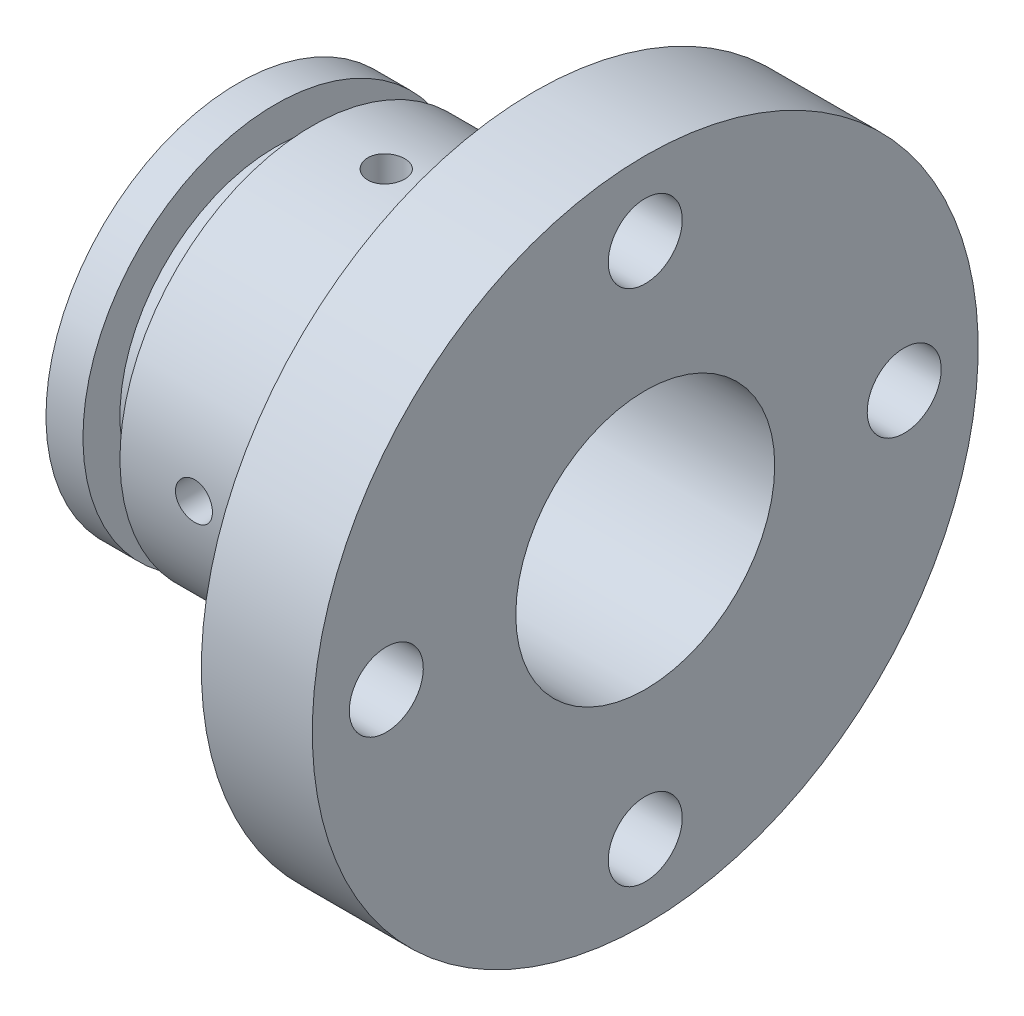
ISO-10303-21;
HEADER;
FILE_DESCRIPTION(('STEP AP214'),'2;1');
FILE_NAME('part.step','',(''),(''),'','','');
FILE_SCHEMA(('AUTOMOTIVE_DESIGN { 1 0 10303 214 1 1 1 1 }'));
ENDSEC;
DATA;
#1=APPLICATION_CONTEXT('core data for automotive mechanical design processes');
#2=APPLICATION_PROTOCOL_DEFINITION('international standard','automotive_design',2000,#1);
#3=PRODUCT_CONTEXT('',#1,'mechanical');
#4=PRODUCT('Part','Part','',(#3));
#5=PRODUCT_RELATED_PRODUCT_CATEGORY('part','',(#4));
#6=PRODUCT_DEFINITION_FORMATION('','',#4);
#7=PRODUCT_DEFINITION_CONTEXT('part definition',#1,'design');
#8=PRODUCT_DEFINITION('design','',#6,#7);
#9=PRODUCT_DEFINITION_SHAPE('','',#8);
#10=(LENGTH_UNIT() NAMED_UNIT(*) SI_UNIT(.MILLI.,.METRE.));
#11=(NAMED_UNIT(*) PLANE_ANGLE_UNIT() SI_UNIT($,.RADIAN.));
#12=(NAMED_UNIT(*) SI_UNIT($,.STERADIAN.) SOLID_ANGLE_UNIT());
#13=UNCERTAINTY_MEASURE_WITH_UNIT(LENGTH_MEASURE(1.E-05),#10,'distance_accuracy_value','');
#14=(GEOMETRIC_REPRESENTATION_CONTEXT(3) GLOBAL_UNCERTAINTY_ASSIGNED_CONTEXT((#13)) GLOBAL_UNIT_ASSIGNED_CONTEXT((#10,
#11,#12)) REPRESENTATION_CONTEXT('',''));
#15=CARTESIAN_POINT('',(0.,0.,0.));
#16=DIRECTION('',(0.,0.,1.));
#17=DIRECTION('',(1.,0.,0.));
#18=AXIS2_PLACEMENT_3D('',#15,#16,#17);
#19=CARTESIAN_POINT('',(0.,0.,0.));
#20=DIRECTION('',(1.,0.,0.));
#21=DIRECTION('',(0.,1.,0.));
#22=AXIS2_PLACEMENT_3D('',#19,#20,#21);
#23=PLANE('',#22);
#24=CARTESIAN_POINT('',(0.,0.,0.));
#25=DIRECTION('',(-1.,0.,0.));
#26=DIRECTION('',(0.,-1.,0.));
#27=AXIS2_PLACEMENT_3D('',#24,#25,#26);
#28=CIRCLE('',#27,17.5);
#29=CARTESIAN_POINT('',(0.,-17.5,0.));
#30=VERTEX_POINT('',#29);
#31=EDGE_CURVE('E131',#30,#30,#28,.T.);
#32=ORIENTED_EDGE('',*,*,#31,.F.);
#33=EDGE_LOOP('',(#32));
#34=FACE_BOUND('',#33,.T.);
#35=CARTESIAN_POINT('',(0.,0.,0.));
#36=DIRECTION('',(-1.,0.,0.));
#37=DIRECTION('',(0.,-1.,0.));
#38=AXIS2_PLACEMENT_3D('',#35,#36,#37);
#39=CIRCLE('',#38,26.);
#40=CARTESIAN_POINT('',(0.,-26.,0.));
#41=VERTEX_POINT('',#40);
#42=EDGE_CURVE('E94',#41,#41,#39,.T.);
#43=ORIENTED_EDGE('',*,*,#42,.T.);
#44=EDGE_LOOP('',(#43));
#45=FACE_BOUND('',#44,.T.);
#46=ADVANCED_FACE('F33',(#34,#45),#23,.F.);
#47=CARTESIAN_POINT('',(0.,0.,0.));
#48=DIRECTION('',(-1.,0.,0.));
#49=DIRECTION('',(0.,-1.,0.));
#50=AXIS2_PLACEMENT_3D('',#47,#48,#49);
#51=CYLINDRICAL_SURFACE('',#50,26.);
#52=ORIENTED_EDGE('',*,*,#42,.F.);
#53=EDGE_LOOP('',(#52));
#54=FACE_BOUND('',#53,.T.);
#55=CARTESIAN_POINT('',(5.,0.,0.));
#56=DIRECTION('',(-1.,0.,0.));
#57=DIRECTION('',(0.,-1.,0.));
#58=AXIS2_PLACEMENT_3D('',#55,#56,#57);
#59=CIRCLE('',#58,26.);
#60=CARTESIAN_POINT('',(5.,-26.,0.));
#61=VERTEX_POINT('',#60);
#62=EDGE_CURVE('E97',#61,#61,#59,.T.);
#63=ORIENTED_EDGE('',*,*,#62,.T.);
#64=EDGE_LOOP('',(#63));
#65=FACE_BOUND('',#64,.T.);
#66=ADVANCED_FACE('F186',(#54,#65),#51,.T.);
#67=CARTESIAN_POINT('',(5.,26.,0.));
#68=DIRECTION('',(-1.,0.,0.));
#69=DIRECTION('',(0.,-1.,0.));
#70=AXIS2_PLACEMENT_3D('',#67,#68,#69);
#71=PLANE('',#70);
#72=ORIENTED_EDGE('',*,*,#62,.F.);
#73=EDGE_LOOP('',(#72));
#74=FACE_BOUND('',#73,.T.);
#75=CARTESIAN_POINT('',(5.,0.,0.));
#76=DIRECTION('',(-1.,0.,0.));
#77=DIRECTION('',(0.,-1.,0.));
#78=AXIS2_PLACEMENT_3D('',#75,#76,#77);
#79=CIRCLE('',#78,21.);
#80=CARTESIAN_POINT('',(5.,-21.,0.));
#81=VERTEX_POINT('',#80);
#82=EDGE_CURVE('E100',#81,#81,#79,.T.);
#83=ORIENTED_EDGE('',*,*,#82,.T.);
#84=EDGE_LOOP('',(#83));
#85=FACE_BOUND('',#84,.T.);
#86=ADVANCED_FACE('F191',(#74,#85),#71,.F.);
#87=CARTESIAN_POINT('',(0.,0.,0.));
#88=DIRECTION('',(-1.,0.,0.));
#89=DIRECTION('',(0.,-1.,0.));
#90=AXIS2_PLACEMENT_3D('',#87,#88,#89);
#91=CYLINDRICAL_SURFACE('',#90,21.);
#92=ORIENTED_EDGE('',*,*,#82,.F.);
#93=EDGE_LOOP('',(#92));
#94=FACE_BOUND('',#93,.T.);
#95=CARTESIAN_POINT('',(10.,0.,0.));
#96=DIRECTION('',(-1.,0.,0.));
#97=DIRECTION('',(0.,-1.,0.));
#98=AXIS2_PLACEMENT_3D('',#95,#96,#97);
#99=CIRCLE('',#98,21.);
#100=CARTESIAN_POINT('',(10.,-21.,0.));
#101=VERTEX_POINT('',#100);
#102=EDGE_CURVE('E103',#101,#101,#99,.T.);
#103=ORIENTED_EDGE('',*,*,#102,.T.);
#104=EDGE_LOOP('',(#103));
#105=FACE_BOUND('',#104,.T.);
#106=ADVANCED_FACE('F201',(#94,#105),#91,.T.);
#107=CARTESIAN_POINT('',(10.,21.,0.));
#108=DIRECTION('',(1.,0.,0.));
#109=DIRECTION('',(0.,1.,0.));
#110=AXIS2_PLACEMENT_3D('',#107,#108,#109);
#111=PLANE('',#110);
#112=ORIENTED_EDGE('',*,*,#102,.F.);
#113=EDGE_LOOP('',(#112));
#114=FACE_BOUND('',#113,.T.);
#115=CARTESIAN_POINT('',(10.,0.,0.));
#116=DIRECTION('',(-1.,0.,0.));
#117=DIRECTION('',(0.,-1.,0.));
#118=AXIS2_PLACEMENT_3D('',#115,#116,#117);
#119=CIRCLE('',#118,26.);
#120=CARTESIAN_POINT('',(10.,-26.,0.));
#121=VERTEX_POINT('',#120);
#122=EDGE_CURVE('E106',#121,#121,#119,.T.);
#123=ORIENTED_EDGE('',*,*,#122,.T.);
#124=EDGE_LOOP('',(#123));
#125=FACE_BOUND('',#124,.T.);
#126=ADVANCED_FACE('F207',(#114,#125),#111,.F.);
#127=CARTESIAN_POINT('',(0.,0.,0.));
#128=DIRECTION('',(-1.,0.,0.));
#129=DIRECTION('',(0.,-1.,0.));
#130=AXIS2_PLACEMENT_3D('',#127,#128,#129);
#131=CYLINDRICAL_SURFACE('',#130,26.);
#132=CARTESIAN_POINT('',(17.5,0.,-26.));
#133=CARTESIAN_POINT('',(17.5000060795447,-0.140079090854674,-25.9999984437906));
#134=CARTESIAN_POINT('',(17.5118129204513,-0.28025147342537,-25.9988559141148));
#135=CARTESIAN_POINT('',(17.558735575232,-0.556712047945503,-25.9944079975224));
#136=CARTESIAN_POINT('',(17.593877248676,-0.69299575552845,-25.9911002111345));
#137=CARTESIAN_POINT('',(17.6864387737537,-0.957635386774746,-25.9826952711498));
#138=CARTESIAN_POINT('',(17.7438453794757,-1.08599597155153,-25.9775991816262));
#139=CARTESIAN_POINT('',(17.8792819794221,-1.33123092777167,-25.9661878781254));
#140=CARTESIAN_POINT('',(17.9573077962421,-1.44810761925297,-25.9598729111596));
#141=CARTESIAN_POINT('',(18.1320479947142,-1.66747611994793,-25.9467079644338));
#142=CARTESIAN_POINT('',(18.2288171512393,-1.76992420977562,-25.9398564525333));
#143=CARTESIAN_POINT('',(18.4381804953508,-1.95715176372564,-25.9264033385004));
#144=CARTESIAN_POINT('',(18.5507754052057,-2.04193042099749,-25.9198017477916));
#145=CARTESIAN_POINT('',(18.7888657687647,-2.19156588685478,-25.9075800992323));
#146=CARTESIAN_POINT('',(18.9143860361369,-2.25638338608997,-25.9019619874055));
#147=CARTESIAN_POINT('',(19.1745917865878,-2.36400558433373,-25.8923620817987));
#148=CARTESIAN_POINT('',(19.309277059161,-2.4068107887361,-25.8883802504507));
#149=CARTESIAN_POINT('',(19.5835453932253,-2.46906431941265,-25.8825173839812));
#150=CARTESIAN_POINT('',(19.7231119173661,-2.48858488177616,-25.8806298529777));
#151=CARTESIAN_POINT('',(20.003552123584,-2.50393827325608,-25.8791490548213));
#152=CARTESIAN_POINT('',(20.1444257736498,-2.4997716809479,-25.8795557316307));
#153=CARTESIAN_POINT('',(20.4229841209804,-2.46792861461948,-25.8826114739717));
#154=CARTESIAN_POINT('',(20.5606779180196,-2.44033092173844,-25.8852530251998));
#155=CARTESIAN_POINT('',(20.8294701753833,-2.36253158706054,-25.8924691316369));
#156=CARTESIAN_POINT('',(20.960568552651,-2.31232966068504,-25.8970437111818));
#157=CARTESIAN_POINT('',(21.2126979766693,-2.19065964060156,-25.9076190837894));
#158=CARTESIAN_POINT('',(21.3337120071788,-2.11915649747563,-25.9136222241315));
#159=CARTESIAN_POINT('',(21.5620514185925,-1.95693896043829,-25.9263762889278));
#160=CARTESIAN_POINT('',(21.6693764291394,-1.86622404692758,-25.9331272336046));
#161=CARTESIAN_POINT('',(21.8677490999357,-1.66771756427795,-25.9466497190775));
#162=CARTESIAN_POINT('',(21.9587286755267,-1.55985794057086,-25.9534212317548));
#163=CARTESIAN_POINT('',(22.1213005107823,-1.33036036240694,-25.9661958524457));
#164=CARTESIAN_POINT('',(22.1928927511195,-1.20872239421452,-25.9721989596933));
#165=CARTESIAN_POINT('',(22.314654572159,-0.955074529864973,-25.9827621399536));
#166=CARTESIAN_POINT('',(22.3648208067521,-0.823063017475309,-25.9873219875431));
#167=CARTESIAN_POINT('',(22.4422572334155,-0.552437151847819,-25.9944825144887));
#168=CARTESIAN_POINT('',(22.469528058398,-0.413822981243308,-25.9970832480017));
#169=CARTESIAN_POINT('',(22.500313423012,-0.134516292943447,-26.0000255598987));
#170=CARTESIAN_POINT('',(22.5039219368079,0.00616577666777665,-26.0003760748421));
#171=CARTESIAN_POINT('',(22.4875269091482,0.286132732074387,-25.9988023954169));
#172=CARTESIAN_POINT('',(22.4675236622326,0.425417635276579,-25.9968782294233));
#173=CARTESIAN_POINT('',(22.4045508762007,0.698366045011988,-25.9909771818486));
#174=CARTESIAN_POINT('',(22.3616252288135,0.832039769936615,-25.9870042237842));
#175=CARTESIAN_POINT('',(22.2540711814364,1.09028867454175,-25.9774514488813));
#176=CARTESIAN_POINT('',(22.1894423297939,1.21486366480818,-25.971871598603));
#177=CARTESIAN_POINT('',(22.0400826287288,1.45180444623828,-25.959707247497));
#178=CARTESIAN_POINT('',(21.9552899101502,1.56413107702371,-25.9531196773054));
#179=CARTESIAN_POINT('',(21.7680983022725,1.7729904700032,-25.9396892637475));
#180=CARTESIAN_POINT('',(21.6656990048971,1.86952286602531,-25.9328464144675));
#181=CARTESIAN_POINT('',(21.4457914914339,2.0443789087774,-25.9196498912404));
#182=CARTESIAN_POINT('',(21.3282341871747,2.12264096626374,-25.9132979188273));
#183=CARTESIAN_POINT('',(21.0815903444793,2.258311638668,-25.9018278100116));
#184=CARTESIAN_POINT('',(20.9525039533887,2.31572052004911,-25.8967096578435));
#185=CARTESIAN_POINT('',(20.686679134506,2.40795165942864,-25.8882970631817));
#186=CARTESIAN_POINT('',(20.5499536097823,2.44281082321462,-25.884999642107));
#187=CARTESIAN_POINT('',(20.2725568158129,2.48907285341934,-25.8805924383109));
#188=CARTESIAN_POINT('',(20.1318856505441,2.50047633736266,-25.8794825979963));
#189=CARTESIAN_POINT('',(19.8512028378354,2.49949509488683,-25.8795773402073));
#190=CARTESIAN_POINT('',(19.7111908388983,2.48720712118753,-25.8807725093909));
#191=CARTESIAN_POINT('',(19.435229742357,2.43939436217776,-25.8853225515069));
#192=CARTESIAN_POINT('',(19.2992806497663,2.40386954819406,-25.8886774271044));
#193=CARTESIAN_POINT('',(19.0353034956637,2.31061770191277,-25.897166294633));
#194=CARTESIAN_POINT('',(18.9072745164991,2.25289324735918,-25.9023000799965));
#195=CARTESIAN_POINT('',(18.6627075929651,2.11689084932903,-25.9137687305501));
#196=CARTESIAN_POINT('',(18.5461695557977,2.03861307185499,-25.9201035860394));
#197=CARTESIAN_POINT('',(18.3273968050978,1.86336245414304,-25.9332915481553));
#198=CARTESIAN_POINT('',(18.2252199030497,1.76631758951771,-25.9401465874947));
#199=CARTESIAN_POINT('',(18.0385570801371,1.55642789703953,-25.9535848491687));
#200=CARTESIAN_POINT('',(17.9540754129547,1.44357928104373,-25.9601680058418));
#201=CARTESIAN_POINT('',(17.8050475625293,1.20499811214644,-25.9723366306832));
#202=CARTESIAN_POINT('',(17.7405487616874,1.07923586421222,-25.9779197145149));
#203=CARTESIAN_POINT('',(17.6336689756516,0.818694200894287,-25.987432796859));
#204=CARTESIAN_POINT('',(17.5912629322406,0.683925197919737,-25.9913646672371));
#205=CARTESIAN_POINT('',(17.5404023717073,0.456987645640416,-25.996139051485));
#206=CARTESIAN_POINT('',(17.5252720435919,0.366272046132639,-25.9975801953512));
#207=CARTESIAN_POINT('',(17.5050688827514,0.183717673427665,-25.999511178193));
#208=CARTESIAN_POINT('',(17.499996012382,0.091878904435699,-26.0000010207292));
#209=CARTESIAN_POINT('',(17.5,0.,-26.));
#210=B_SPLINE_CURVE_WITH_KNOTS('',3,(#132,#133,#134,#135,#136,#137,#138,#139,#140,#141,#142,
#143,#144,#145,#146,#147,#148,#149,#150,#151,#152,#153,#154,#155,#156,#157,#158,#159,#160,#161,
#162,#163,#164,#165,#166,#167,#168,#169,#170,#171,#172,#173,#174,#175,#176,#177,#178,#179,#180,
#181,#182,#183,#184,#185,#186,#187,#188,#189,#190,#191,#192,#193,#194,#195,#196,#197,#198,#199,
#200,#201,#202,#203,#204,#205,#206,#207,#208,#209),.UNSPECIFIED.,.T.,.F.,(4,2,2,2,2,2,2,2,2,2,2,
2,2,2,2,2,2,2,2,2,2,2,2,2,2,2,2,2,2,2,2,2,2,2,2,2,2,2,4),(0.,0.419901777372053,
0.840269666585885,1.26038785209968,1.68042098780869,2.1017006561163,2.52299955737102,
2.94512289071348,3.36723653183419,3.78803721280071,4.20882761545858,4.62820879438875,
5.04759525331475,5.46767562620042,5.8877673619822,6.30957029209389,6.73137364270305,
7.15324284247044,7.57510037986229,7.99528150261323,8.41545738395725,8.8348315838985,
9.2542145117295,9.67490123167567,10.0955977033983,10.5176924982603,10.9397818993785,
11.3611787321835,11.782564470608,12.2022329710147,12.6219019892742,13.0415222917529,
13.4611392051987,13.8823996846186,14.3037613131246,14.726114539524,15.1479876725087,
15.4234053629249,15.6988220224717),.UNSPECIFIED.);
#211=CARTESIAN_POINT('',(17.5,0.,-26.));
#212=VERTEX_POINT('',#211);
#213=EDGE_CURVE('E10',#212,#212,#210,.T.);
#214=ORIENTED_EDGE('',*,*,#213,.T.);
#215=EDGE_LOOP('',(#214));
#216=FACE_BOUND('',#215,.T.);
#217=CARTESIAN_POINT('',(22.5,-26.,0.));
#218=CARTESIAN_POINT('',(22.4999939204553,-25.9999984437906,-0.140079090854674));
#219=CARTESIAN_POINT('',(22.4881870795487,-25.9988559141148,-0.28025147342537));
#220=CARTESIAN_POINT('',(22.441264424768,-25.9944079975224,-0.556712047945503));
#221=CARTESIAN_POINT('',(22.406122751324,-25.9911002111345,-0.692995755528449));
#222=CARTESIAN_POINT('',(22.3135612262463,-25.9826952711498,-0.957635386774748));
#223=CARTESIAN_POINT('',(22.2561546205243,-25.9775991816262,-1.08599597155153));
#224=CARTESIAN_POINT('',(22.1207180205779,-25.9661878781254,-1.33123092777168));
#225=CARTESIAN_POINT('',(22.042692203758,-25.9598729111596,-1.44810761925297));
#226=CARTESIAN_POINT('',(21.8679520052858,-25.9467079644338,-1.66747611994793));
#227=CARTESIAN_POINT('',(21.7711828487607,-25.9398564525333,-1.76992420977562));
#228=CARTESIAN_POINT('',(21.5618195046492,-25.9264033385004,-1.95715176372564));
#229=CARTESIAN_POINT('',(21.4492245947943,-25.9198017477916,-2.04193042099749));
#230=CARTESIAN_POINT('',(21.2111342312353,-25.9075800992323,-2.19156588685478));
#231=CARTESIAN_POINT('',(21.0856139638631,-25.9019619874055,-2.25638338608997));
#232=CARTESIAN_POINT('',(20.8254082134122,-25.8923620817987,-2.36400558433373));
#233=CARTESIAN_POINT('',(20.690722940839,-25.8883802504507,-2.4068107887361));
#234=CARTESIAN_POINT('',(20.4164546067747,-25.8825173839812,-2.46906431941265));
#235=CARTESIAN_POINT('',(20.2768880826339,-25.8806298529777,-2.48858488177616));
#236=CARTESIAN_POINT('',(19.996447876416,-25.8791490548213,-2.50393827325608));
#237=CARTESIAN_POINT('',(19.8555742263502,-25.8795557316307,-2.4997716809479));
#238=CARTESIAN_POINT('',(19.5770158790196,-25.8826114739717,-2.46792861461948));
#239=CARTESIAN_POINT('',(19.4393220819804,-25.8852530251998,-2.44033092173844));
#240=CARTESIAN_POINT('',(19.1705298246167,-25.8924691316369,-2.36253158706054));
#241=CARTESIAN_POINT('',(19.039431447349,-25.8970437111818,-2.31232966068504));
#242=CARTESIAN_POINT('',(18.7873020233307,-25.9076190837894,-2.19065964060156));
#243=CARTESIAN_POINT('',(18.6662879928213,-25.9136222241315,-2.11915649747563));
#244=CARTESIAN_POINT('',(18.4379485814075,-25.9263762889278,-1.95693896043829));
#245=CARTESIAN_POINT('',(18.3306235708606,-25.9331272336046,-1.86622404692758));
#246=CARTESIAN_POINT('',(18.1322509000643,-25.9466497190775,-1.66771756427795));
#247=CARTESIAN_POINT('',(18.0412713244733,-25.9534212317548,-1.55985794057086));
#248=CARTESIAN_POINT('',(17.8786994892177,-25.9661958524457,-1.33036036240694));
#249=CARTESIAN_POINT('',(17.8071072488805,-25.9721989596933,-1.20872239421452));
#250=CARTESIAN_POINT('',(17.685345427841,-25.9827621399536,-0.955074529864973));
#251=CARTESIAN_POINT('',(17.6351791932479,-25.9873219875431,-0.823063017475309));
#252=CARTESIAN_POINT('',(17.5577427665845,-25.9944825144887,-0.552437151847819));
#253=CARTESIAN_POINT('',(17.5304719416021,-25.9970832480017,-0.413822981243308));
#254=CARTESIAN_POINT('',(17.499686576988,-26.0000255598987,-0.134516292943447));
#255=CARTESIAN_POINT('',(17.4960780631921,-26.0003760748421,0.00616577666777605));
#256=CARTESIAN_POINT('',(17.5124730908518,-25.9988023954169,0.286132732074386));
#257=CARTESIAN_POINT('',(17.5324763377674,-25.9968782294233,0.425417635276578));
#258=CARTESIAN_POINT('',(17.5954491237993,-25.9909771818486,0.698366045011988));
#259=CARTESIAN_POINT('',(17.6383747711865,-25.9870042237842,0.832039769936615));
#260=CARTESIAN_POINT('',(17.7459288185636,-25.9774514488813,1.09028867454175));
#261=CARTESIAN_POINT('',(17.8105576702061,-25.971871598603,1.21486366480818));
#262=CARTESIAN_POINT('',(17.9599173712712,-25.959707247497,1.45180444623828));
#263=CARTESIAN_POINT('',(18.0447100898498,-25.9531196773054,1.56413107702371));
#264=CARTESIAN_POINT('',(18.2319016977275,-25.9396892637475,1.7729904700032));
#265=CARTESIAN_POINT('',(18.3343009951029,-25.9328464144675,1.86952286602531));
#266=CARTESIAN_POINT('',(18.5542085085661,-25.9196498912404,2.0443789087774));
#267=CARTESIAN_POINT('',(18.6717658128253,-25.9132979188273,2.12264096626374));
#268=CARTESIAN_POINT('',(18.9184096555207,-25.9018278100116,2.258311638668));
#269=CARTESIAN_POINT('',(19.0474960466113,-25.8967096578435,2.31572052004911));
#270=CARTESIAN_POINT('',(19.313320865494,-25.8882970631817,2.40795165942864));
#271=CARTESIAN_POINT('',(19.4500463902177,-25.884999642107,2.44281082321462));
#272=CARTESIAN_POINT('',(19.7274431841871,-25.8805924383109,2.48907285341934));
#273=CARTESIAN_POINT('',(19.8681143494559,-25.8794825979963,2.50047633736266));
#274=CARTESIAN_POINT('',(20.1487971621646,-25.8795773402073,2.49949509488683));
#275=CARTESIAN_POINT('',(20.2888091611017,-25.8807725093909,2.48720712118753));
#276=CARTESIAN_POINT('',(20.564770257643,-25.8853225515069,2.43939436217776));
#277=CARTESIAN_POINT('',(20.7007193502337,-25.8886774271044,2.40386954819406));
#278=CARTESIAN_POINT('',(20.9646965043363,-25.897166294633,2.31061770191277));
#279=CARTESIAN_POINT('',(21.092725483501,-25.9023000799965,2.25289324735918));
#280=CARTESIAN_POINT('',(21.3372924070349,-25.9137687305501,2.11689084932903));
#281=CARTESIAN_POINT('',(21.4538304442023,-25.9201035860394,2.03861307185499));
#282=CARTESIAN_POINT('',(21.6726031949022,-25.9332915481553,1.86336245414304));
#283=CARTESIAN_POINT('',(21.7747800969503,-25.9401465874947,1.76631758951771));
#284=CARTESIAN_POINT('',(21.9614429198629,-25.9535848491687,1.55642789703953));
#285=CARTESIAN_POINT('',(22.0459245870453,-25.9601680058418,1.44357928104372));
#286=CARTESIAN_POINT('',(22.1949524374707,-25.9723366306832,1.20499811214644));
#287=CARTESIAN_POINT('',(22.2594512383126,-25.9779197145149,1.07923586421222));
#288=CARTESIAN_POINT('',(22.3663310243484,-25.987432796859,0.818694200894287));
#289=CARTESIAN_POINT('',(22.4087370677595,-25.9913646672371,0.683925197919737));
#290=CARTESIAN_POINT('',(22.4595976282927,-25.996139051485,0.456987645640416));
#291=CARTESIAN_POINT('',(22.4747279564081,-25.9975801953512,0.366272046132639));
#292=CARTESIAN_POINT('',(22.4949311172486,-25.999511178193,0.183717673427664));
#293=CARTESIAN_POINT('',(22.500003987618,-26.0000010207292,0.0918789044356988));
#294=CARTESIAN_POINT('',(22.5,-26.,0.));
#295=B_SPLINE_CURVE_WITH_KNOTS('',3,(#217,#218,#219,#220,#221,#222,#223,#224,#225,#226,#227,
#228,#229,#230,#231,#232,#233,#234,#235,#236,#237,#238,#239,#240,#241,#242,#243,#244,#245,#246,
#247,#248,#249,#250,#251,#252,#253,#254,#255,#256,#257,#258,#259,#260,#261,#262,#263,#264,#265,
#266,#267,#268,#269,#270,#271,#272,#273,#274,#275,#276,#277,#278,#279,#280,#281,#282,#283,#284,
#285,#286,#287,#288,#289,#290,#291,#292,#293,#294),.UNSPECIFIED.,.T.,.F.,(4,2,2,2,2,2,2,2,2,2,2,
2,2,2,2,2,2,2,2,2,2,2,2,2,2,2,2,2,2,2,2,2,2,2,2,2,2,2,4),(0.,0.419901777372053,
0.840269666585885,1.26038785209969,1.68042098780869,2.1017006561163,2.52299955737102,
2.94512289071348,3.36723653183419,3.78803721280071,4.20882761545858,4.62820879438876,
5.04759525331475,5.46767562620042,5.8877673619822,6.30957029209389,6.73137364270305,
7.15324284247044,7.57510037986229,7.99528150261323,8.41545738395725,8.8348315838985,
9.2542145117295,9.67490123167567,10.0955977033983,10.5176924982603,10.9397818993785,
11.3611787321835,11.782564470608,12.2022329710147,12.6219019892742,13.0415222917529,
13.4611392051987,13.8823996846186,14.3037613131246,14.726114539524,15.1479876725087,
15.4234053629249,15.6988220224717),.UNSPECIFIED.);
#296=CARTESIAN_POINT('',(22.5,-26.,0.));
#297=VERTEX_POINT('',#296);
#298=EDGE_CURVE('E43',#297,#297,#295,.T.);
#299=ORIENTED_EDGE('',*,*,#298,.T.);
#300=EDGE_LOOP('',(#299));
#301=FACE_BOUND('',#300,.T.);
#302=CARTESIAN_POINT('',(22.5,0.,26.));
#303=CARTESIAN_POINT('',(22.4999939204553,-0.140079090854674,25.9999984437906));
#304=CARTESIAN_POINT('',(22.4881870795487,-0.28025147342537,25.9988559141148));
#305=CARTESIAN_POINT('',(22.441264424768,-0.556712047945503,25.9944079975224));
#306=CARTESIAN_POINT('',(22.406122751324,-0.692995755528449,25.9911002111345));
#307=CARTESIAN_POINT('',(22.3135612262463,-0.957635386774747,25.9826952711498));
#308=CARTESIAN_POINT('',(22.2561546205243,-1.08599597155153,25.9775991816262));
#309=CARTESIAN_POINT('',(22.1207180205779,-1.33123092777168,25.9661878781254));
#310=CARTESIAN_POINT('',(22.042692203758,-1.44810761925297,25.9598729111596));
#311=CARTESIAN_POINT('',(21.8679520052858,-1.66747611994793,25.9467079644338));
#312=CARTESIAN_POINT('',(21.7711828487607,-1.76992420977562,25.9398564525333));
#313=CARTESIAN_POINT('',(21.5618195046492,-1.95715176372564,25.9264033385004));
#314=CARTESIAN_POINT('',(21.4492245947943,-2.04193042099749,25.9198017477916));
#315=CARTESIAN_POINT('',(21.2111342312353,-2.19156588685478,25.9075800992323));
#316=CARTESIAN_POINT('',(21.0856139638631,-2.25638338608997,25.9019619874055));
#317=CARTESIAN_POINT('',(20.8254082134122,-2.36400558433373,25.8923620817987));
#318=CARTESIAN_POINT('',(20.690722940839,-2.4068107887361,25.8883802504507));
#319=CARTESIAN_POINT('',(20.4164546067747,-2.46906431941265,25.8825173839812));
#320=CARTESIAN_POINT('',(20.2768880826339,-2.48858488177617,25.8806298529777));
#321=CARTESIAN_POINT('',(19.996447876416,-2.50393827325609,25.8791490548213));
#322=CARTESIAN_POINT('',(19.8555742263502,-2.49977168094791,25.8795557316307));
#323=CARTESIAN_POINT('',(19.5770158790196,-2.46792861461948,25.8826114739717));
#324=CARTESIAN_POINT('',(19.4393220819804,-2.44033092173845,25.8852530251998));
#325=CARTESIAN_POINT('',(19.1705298246167,-2.36253158706054,25.8924691316369));
#326=CARTESIAN_POINT('',(19.039431447349,-2.31232966068505,25.8970437111818));
#327=CARTESIAN_POINT('',(18.7873020233307,-2.19065964060156,25.9076190837894));
#328=CARTESIAN_POINT('',(18.6662879928213,-2.11915649747563,25.9136222241315));
#329=CARTESIAN_POINT('',(18.4379485814075,-1.95693896043829,25.9263762889278));
#330=CARTESIAN_POINT('',(18.3306235708606,-1.86622404692758,25.9331272336046));
#331=CARTESIAN_POINT('',(18.1322509000643,-1.66771756427796,25.9466497190775));
#332=CARTESIAN_POINT('',(18.0412713244733,-1.55985794057086,25.9534212317548));
#333=CARTESIAN_POINT('',(17.8786994892177,-1.33036036240694,25.9661958524457));
#334=CARTESIAN_POINT('',(17.8071072488805,-1.20872239421453,25.9721989596933));
#335=CARTESIAN_POINT('',(17.685345427841,-0.955074529864974,25.9827621399536));
#336=CARTESIAN_POINT('',(17.6351791932479,-0.823063017475311,25.9873219875431));
#337=CARTESIAN_POINT('',(17.5577427665845,-0.552437151847821,25.9944825144887));
#338=CARTESIAN_POINT('',(17.5304719416021,-0.413822981243309,25.9970832480017));
#339=CARTESIAN_POINT('',(17.499686576988,-0.134516292943448,26.0000255598987));
#340=CARTESIAN_POINT('',(17.4960780631921,0.00616577666777497,26.0003760748421));
#341=CARTESIAN_POINT('',(17.5124730908518,0.286132732074386,25.9988023954169));
#342=CARTESIAN_POINT('',(17.5324763377674,0.425417635276578,25.9968782294233));
#343=CARTESIAN_POINT('',(17.5954491237993,0.698366045011987,25.9909771818486));
#344=CARTESIAN_POINT('',(17.6383747711865,0.832039769936614,25.9870042237842));
#345=CARTESIAN_POINT('',(17.7459288185636,1.09028867454175,25.9774514488813));
#346=CARTESIAN_POINT('',(17.8105576702061,1.21486366480818,25.971871598603));
#347=CARTESIAN_POINT('',(17.9599173712712,1.45180444623828,25.959707247497));
#348=CARTESIAN_POINT('',(18.0447100898498,1.56413107702371,25.9531196773054));
#349=CARTESIAN_POINT('',(18.2319016977275,1.7729904700032,25.9396892637475));
#350=CARTESIAN_POINT('',(18.3343009951029,1.86952286602531,25.9328464144675));
#351=CARTESIAN_POINT('',(18.5542085085661,2.0443789087774,25.9196498912404));
#352=CARTESIAN_POINT('',(18.6717658128253,2.12264096626375,25.9132979188273));
#353=CARTESIAN_POINT('',(18.9184096555207,2.258311638668,25.9018278100116));
#354=CARTESIAN_POINT('',(19.0474960466113,2.31572052004911,25.8967096578435));
#355=CARTESIAN_POINT('',(19.313320865494,2.40795165942864,25.8882970631817));
#356=CARTESIAN_POINT('',(19.4500463902177,2.44281082321463,25.884999642107));
#357=CARTESIAN_POINT('',(19.7274431841871,2.48907285341935,25.8805924383109));
#358=CARTESIAN_POINT('',(19.8681143494559,2.50047633736267,25.8794825979963));
#359=CARTESIAN_POINT('',(20.1487971621646,2.49949509488683,25.8795773402073));
#360=CARTESIAN_POINT('',(20.2888091611017,2.48720712118753,25.8807725093909));
#361=CARTESIAN_POINT('',(20.564770257643,2.43939436217776,25.8853225515069));
#362=CARTESIAN_POINT('',(20.7007193502337,2.40386954819407,25.8886774271044));
#363=CARTESIAN_POINT('',(20.9646965043363,2.31061770191278,25.897166294633));
#364=CARTESIAN_POINT('',(21.092725483501,2.25289324735918,25.9023000799965));
#365=CARTESIAN_POINT('',(21.3372924070349,2.11689084932903,25.9137687305501));
#366=CARTESIAN_POINT('',(21.4538304442023,2.03861307185499,25.9201035860394));
#367=CARTESIAN_POINT('',(21.6726031949022,1.86336245414304,25.9332915481553));
#368=CARTESIAN_POINT('',(21.7747800969503,1.76631758951771,25.9401465874947));
#369=CARTESIAN_POINT('',(21.9614429198629,1.55642789703953,25.9535848491687));
#370=CARTESIAN_POINT('',(22.0459245870453,1.44357928104373,25.9601680058418));
#371=CARTESIAN_POINT('',(22.1949524374707,1.20499811214644,25.9723366306832));
#372=CARTESIAN_POINT('',(22.2594512383126,1.07923586421222,25.9779197145149));
#373=CARTESIAN_POINT('',(22.3663310243484,0.818694200894289,25.987432796859));
#374=CARTESIAN_POINT('',(22.4087370677595,0.683925197919739,25.9913646672371));
#375=CARTESIAN_POINT('',(22.4595976282927,0.456987645640417,25.996139051485));
#376=CARTESIAN_POINT('',(22.4747279564081,0.36627204613264,25.9975801953512));
#377=CARTESIAN_POINT('',(22.4949311172486,0.183717673427664,25.999511178193));
#378=CARTESIAN_POINT('',(22.500003987618,0.0918789044356988,26.0000010207292));
#379=CARTESIAN_POINT('',(22.5,0.,26.));
#380=B_SPLINE_CURVE_WITH_KNOTS('',3,(#302,#303,#304,#305,#306,#307,#308,#309,#310,#311,#312,
#313,#314,#315,#316,#317,#318,#319,#320,#321,#322,#323,#324,#325,#326,#327,#328,#329,#330,#331,
#332,#333,#334,#335,#336,#337,#338,#339,#340,#341,#342,#343,#344,#345,#346,#347,#348,#349,#350,
#351,#352,#353,#354,#355,#356,#357,#358,#359,#360,#361,#362,#363,#364,#365,#366,#367,#368,#369,
#370,#371,#372,#373,#374,#375,#376,#377,#378,#379),.UNSPECIFIED.,.T.,.F.,(4,2,2,2,2,2,2,2,2,2,2,
2,2,2,2,2,2,2,2,2,2,2,2,2,2,2,2,2,2,2,2,2,2,2,2,2,2,2,4),(0.,0.419901777372053,
0.840269666585885,1.26038785209969,1.68042098780869,2.1017006561163,2.52299955737102,
2.94512289071348,3.3672365318342,3.78803721280072,4.20882761545859,4.62820879438876,
5.04759525331476,5.46767562620043,5.8877673619822,6.3095702920939,6.73137364270306,
7.15324284247045,7.5751003798623,7.99528150261324,8.41545738395726,8.83483158389851,
9.25421451172951,9.67490123167568,10.0955977033983,10.5176924982603,10.9397818993785,
11.3611787321835,11.782564470608,12.2022329710147,12.6219019892743,13.0415222917529,
13.4611392051987,13.8823996846187,14.3037613131246,14.726114539524,15.1479876725087,
15.4234053629249,15.6988220224717),.UNSPECIFIED.);
#381=CARTESIAN_POINT('',(22.5,0.,26.));
#382=VERTEX_POINT('',#381);
#383=EDGE_CURVE('E47',#382,#382,#380,.T.);
#384=ORIENTED_EDGE('',*,*,#383,.T.);
#385=EDGE_LOOP('',(#384));
#386=FACE_BOUND('',#385,.T.);
#387=CARTESIAN_POINT('',(17.5,26.,0.));
#388=CARTESIAN_POINT('',(17.5000060795447,25.9999984437906,-0.140079090854674));
#389=CARTESIAN_POINT('',(17.5118129204513,25.9988559141148,-0.28025147342537));
#390=CARTESIAN_POINT('',(17.558735575232,25.9944079975224,-0.556712047945503));
#391=CARTESIAN_POINT('',(17.593877248676,25.9911002111345,-0.69299575552845));
#392=CARTESIAN_POINT('',(17.6864387737537,25.9826952711498,-0.957635386774747));
#393=CARTESIAN_POINT('',(17.7438453794757,25.9775991816262,-1.08599597155153));
#394=CARTESIAN_POINT('',(17.8792819794221,25.9661878781254,-1.33123092777168));
#395=CARTESIAN_POINT('',(17.957307796242,25.9598729111596,-1.44810761925297));
#396=CARTESIAN_POINT('',(18.1320479947142,25.9467079644338,-1.66747611994793));
#397=CARTESIAN_POINT('',(18.2288171512393,25.9398564525333,-1.76992420977562));
#398=CARTESIAN_POINT('',(18.4381804953508,25.9264033385004,-1.95715176372564));
#399=CARTESIAN_POINT('',(18.5507754052057,25.9198017477916,-2.04193042099749));
#400=CARTESIAN_POINT('',(18.7888657687647,25.9075800992323,-2.19156588685478));
#401=CARTESIAN_POINT('',(18.9143860361369,25.9019619874055,-2.25638338608997));
#402=CARTESIAN_POINT('',(19.1745917865878,25.8923620817987,-2.36400558433373));
#403=CARTESIAN_POINT('',(19.309277059161,25.8883802504507,-2.4068107887361));
#404=CARTESIAN_POINT('',(19.5835453932253,25.8825173839812,-2.46906431941265));
#405=CARTESIAN_POINT('',(19.7231119173661,25.8806298529777,-2.48858488177617));
#406=CARTESIAN_POINT('',(20.003552123584,25.8791490548213,-2.50393827325609));
#407=CARTESIAN_POINT('',(20.1444257736498,25.8795557316307,-2.49977168094791));
#408=CARTESIAN_POINT('',(20.4229841209804,25.8826114739717,-2.46792861461948));
#409=CARTESIAN_POINT('',(20.5606779180196,25.8852530251998,-2.44033092173845));
#410=CARTESIAN_POINT('',(20.8294701753833,25.8924691316369,-2.36253158706054));
#411=CARTESIAN_POINT('',(20.960568552651,25.8970437111818,-2.31232966068505));
#412=CARTESIAN_POINT('',(21.2126979766693,25.9076190837894,-2.19065964060156));
#413=CARTESIAN_POINT('',(21.3337120071787,25.9136222241315,-2.11915649747563));
#414=CARTESIAN_POINT('',(21.5620514185925,25.9263762889278,-1.9569389604383));
#415=CARTESIAN_POINT('',(21.6693764291394,25.9331272336046,-1.86622404692758));
#416=CARTESIAN_POINT('',(21.8677490999357,25.9466497190775,-1.66771756427796));
#417=CARTESIAN_POINT('',(21.9587286755267,25.9534212317548,-1.55985794057087));
#418=CARTESIAN_POINT('',(22.1213005107823,25.9661958524457,-1.33036036240694));
#419=CARTESIAN_POINT('',(22.1928927511196,25.9721989596933,-1.20872239421453));
#420=CARTESIAN_POINT('',(22.314654572159,25.9827621399536,-0.955074529864974));
#421=CARTESIAN_POINT('',(22.3648208067521,25.9873219875431,-0.823063017475311));
#422=CARTESIAN_POINT('',(22.4422572334155,25.9944825144887,-0.552437151847821));
#423=CARTESIAN_POINT('',(22.469528058398,25.9970832480017,-0.413822981243309));
#424=CARTESIAN_POINT('',(22.500313423012,26.0000255598987,-0.134516292943448));
#425=CARTESIAN_POINT('',(22.5039219368079,26.0003760748421,0.00616577666777543));
#426=CARTESIAN_POINT('',(22.4875269091482,25.9988023954169,0.286132732074386));
#427=CARTESIAN_POINT('',(22.4675236622326,25.9968782294233,0.425417635276578));
#428=CARTESIAN_POINT('',(22.4045508762007,25.9909771818486,0.698366045011988));
#429=CARTESIAN_POINT('',(22.3616252288135,25.9870042237842,0.832039769936616));
#430=CARTESIAN_POINT('',(22.2540711814364,25.9774514488813,1.09028867454175));
#431=CARTESIAN_POINT('',(22.1894423297939,25.971871598603,1.21486366480818));
#432=CARTESIAN_POINT('',(22.0400826287288,25.959707247497,1.45180444623828));
#433=CARTESIAN_POINT('',(21.9552899101502,25.9531196773054,1.56413107702371));
#434=CARTESIAN_POINT('',(21.7680983022725,25.9396892637475,1.7729904700032));
#435=CARTESIAN_POINT('',(21.6656990048971,25.9328464144675,1.86952286602531));
#436=CARTESIAN_POINT('',(21.4457914914339,25.9196498912404,2.0443789087774));
#437=CARTESIAN_POINT('',(21.3282341871747,25.9132979188273,2.12264096626375));
#438=CARTESIAN_POINT('',(21.0815903444793,25.9018278100116,2.258311638668));
#439=CARTESIAN_POINT('',(20.9525039533887,25.8967096578435,2.31572052004911));
#440=CARTESIAN_POINT('',(20.686679134506,25.8882970631817,2.40795165942864));
#441=CARTESIAN_POINT('',(20.5499536097823,25.884999642107,2.44281082321463));
#442=CARTESIAN_POINT('',(20.2725568158129,25.8805924383109,2.48907285341935));
#443=CARTESIAN_POINT('',(20.1318856505441,25.8794825979963,2.50047633736267));
#444=CARTESIAN_POINT('',(19.8512028378354,25.8795773402073,2.49949509488683));
#445=CARTESIAN_POINT('',(19.7111908388983,25.8807725093909,2.48720712118754));
#446=CARTESIAN_POINT('',(19.435229742357,25.8853225515069,2.43939436217776));
#447=CARTESIAN_POINT('',(19.2992806497663,25.8886774271044,2.40386954819407));
#448=CARTESIAN_POINT('',(19.0353034956637,25.897166294633,2.31061770191278));
#449=CARTESIAN_POINT('',(18.907274516499,25.9023000799965,2.25289324735918));
#450=CARTESIAN_POINT('',(18.6627075929651,25.9137687305501,2.11689084932903));
#451=CARTESIAN_POINT('',(18.5461695557977,25.9201035860394,2.03861307185499));
#452=CARTESIAN_POINT('',(18.3273968050978,25.9332915481553,1.86336245414304));
#453=CARTESIAN_POINT('',(18.2252199030497,25.9401465874947,1.76631758951771));
#454=CARTESIAN_POINT('',(18.0385570801371,25.9535848491687,1.55642789703953));
#455=CARTESIAN_POINT('',(17.9540754129547,25.9601680058418,1.44357928104373));
#456=CARTESIAN_POINT('',(17.8050475625293,25.9723366306832,1.20499811214644));
#457=CARTESIAN_POINT('',(17.7405487616874,25.9779197145149,1.07923586421222));
#458=CARTESIAN_POINT('',(17.6336689756516,25.987432796859,0.818694200894289));
#459=CARTESIAN_POINT('',(17.5912629322406,25.9913646672371,0.683925197919739));
#460=CARTESIAN_POINT('',(17.5404023717073,25.996139051485,0.456987645640417));
#461=CARTESIAN_POINT('',(17.5252720435919,25.9975801953512,0.36627204613264));
#462=CARTESIAN_POINT('',(17.5050688827514,25.999511178193,0.183717673427664));
#463=CARTESIAN_POINT('',(17.499996012382,26.0000010207292,0.0918789044356988));
#464=CARTESIAN_POINT('',(17.5,26.,0.));
#465=B_SPLINE_CURVE_WITH_KNOTS('',3,(#387,#388,#389,#390,#391,#392,#393,#394,#395,#396,#397,
#398,#399,#400,#401,#402,#403,#404,#405,#406,#407,#408,#409,#410,#411,#412,#413,#414,#415,#416,
#417,#418,#419,#420,#421,#422,#423,#424,#425,#426,#427,#428,#429,#430,#431,#432,#433,#434,#435,
#436,#437,#438,#439,#440,#441,#442,#443,#444,#445,#446,#447,#448,#449,#450,#451,#452,#453,#454,
#455,#456,#457,#458,#459,#460,#461,#462,#463,#464),.UNSPECIFIED.,.T.,.F.,(4,2,2,2,2,2,2,2,2,2,2,
2,2,2,2,2,2,2,2,2,2,2,2,2,2,2,2,2,2,2,2,2,2,2,2,2,2,2,4),(0.,0.419901777372053,
0.840269666585886,1.26038785209969,1.68042098780869,2.1017006561163,2.52299955737102,
2.94512289071348,3.3672365318342,3.78803721280071,4.20882761545859,4.62820879438876,
5.04759525331476,5.46767562620043,5.8877673619822,6.3095702920939,6.73137364270306,
7.15324284247045,7.5751003798623,7.99528150261324,8.41545738395726,8.83483158389852,
9.25421451172952,9.67490123167568,10.0955977033983,10.5176924982603,10.9397818993785,
11.3611787321835,11.782564470608,12.2022329710147,12.6219019892743,13.0415222917529,
13.4611392051987,13.8823996846187,14.3037613131246,14.726114539524,15.1479876725087,
15.4234053629249,15.6988220224717),.UNSPECIFIED.);
#466=CARTESIAN_POINT('',(17.5,26.,0.));
#467=VERTEX_POINT('',#466);
#468=EDGE_CURVE('E51',#467,#467,#465,.T.);
#469=ORIENTED_EDGE('',*,*,#468,.T.);
#470=EDGE_LOOP('',(#469));
#471=FACE_BOUND('',#470,.T.);
#472=ORIENTED_EDGE('',*,*,#122,.F.);
#473=EDGE_LOOP('',(#472));
#474=FACE_BOUND('',#473,.T.);
#475=CARTESIAN_POINT('',(30.,0.,0.));
#476=DIRECTION('',(-1.,0.,0.));
#477=DIRECTION('',(0.,-1.,0.));
#478=AXIS2_PLACEMENT_3D('',#475,#476,#477);
#479=CIRCLE('',#478,26.);
#480=CARTESIAN_POINT('',(30.,-26.,0.));
#481=VERTEX_POINT('',#480);
#482=EDGE_CURVE('E109',#481,#481,#479,.T.);
#483=ORIENTED_EDGE('',*,*,#482,.T.);
#484=EDGE_LOOP('',(#483));
#485=FACE_BOUND('',#484,.T.);
#486=ADVANCED_FACE('F60',(#216,#301,#386,#471,#474,#485),#131,.T.);
#487=CARTESIAN_POINT('',(30.,26.,0.));
#488=DIRECTION('',(-1.,0.,0.));
#489=DIRECTION('',(0.,-1.,0.));
#490=AXIS2_PLACEMENT_3D('',#487,#488,#489);
#491=PLANE('',#490);
#492=ORIENTED_EDGE('',*,*,#482,.F.);
#493=EDGE_LOOP('',(#492));
#494=FACE_BOUND('',#493,.T.);
#495=CARTESIAN_POINT('',(30.,0.,0.));
#496=DIRECTION('',(-1.,0.,0.));
#497=DIRECTION('',(0.,-1.,0.));
#498=AXIS2_PLACEMENT_3D('',#495,#496,#497);
#499=CIRCLE('',#498,21.);
#500=CARTESIAN_POINT('',(30.,-21.,0.));
#501=VERTEX_POINT('',#500);
#502=EDGE_CURVE('E112',#501,#501,#499,.T.);
#503=ORIENTED_EDGE('',*,*,#502,.T.);
#504=EDGE_LOOP('',(#503));
#505=FACE_BOUND('',#504,.T.);
#506=ADVANCED_FACE('F217',(#494,#505),#491,.F.);
#507=CARTESIAN_POINT('',(0.,0.,0.));
#508=DIRECTION('',(-1.,0.,0.));
#509=DIRECTION('',(0.,-1.,0.));
#510=AXIS2_PLACEMENT_3D('',#507,#508,#509);
#511=CYLINDRICAL_SURFACE('',#510,21.);
#512=ORIENTED_EDGE('',*,*,#502,.F.);
#513=EDGE_LOOP('',(#512));
#514=FACE_BOUND('',#513,.T.);
#515=CARTESIAN_POINT('',(35.,0.,0.));
#516=DIRECTION('',(-1.,0.,0.));
#517=DIRECTION('',(0.,-1.,0.));
#518=AXIS2_PLACEMENT_3D('',#515,#516,#517);
#519=CIRCLE('',#518,21.);
#520=CARTESIAN_POINT('',(35.,-21.,0.));
#521=VERTEX_POINT('',#520);
#522=EDGE_CURVE('E115',#521,#521,#519,.T.);
#523=ORIENTED_EDGE('',*,*,#522,.T.);
#524=EDGE_LOOP('',(#523));
#525=FACE_BOUND('',#524,.T.);
#526=ADVANCED_FACE('F222',(#514,#525),#511,.T.);
#527=CARTESIAN_POINT('',(35.,21.,0.));
#528=DIRECTION('',(1.,0.,0.));
#529=DIRECTION('',(0.,1.,0.));
#530=AXIS2_PLACEMENT_3D('',#527,#528,#529);
#531=PLANE('',#530);
#532=ORIENTED_EDGE('',*,*,#522,.F.);
#533=EDGE_LOOP('',(#532));
#534=FACE_BOUND('',#533,.T.);
#535=CARTESIAN_POINT('',(35.,0.,0.));
#536=DIRECTION('',(-1.,0.,0.));
#537=DIRECTION('',(0.,-1.,0.));
#538=AXIS2_PLACEMENT_3D('',#535,#536,#537);
#539=CIRCLE('',#538,26.);
#540=CARTESIAN_POINT('',(35.,-26.,0.));
#541=VERTEX_POINT('',#540);
#542=EDGE_CURVE('E118',#541,#541,#539,.T.);
#543=ORIENTED_EDGE('',*,*,#542,.T.);
#544=EDGE_LOOP('',(#543));
#545=FACE_BOUND('',#544,.T.);
#546=ADVANCED_FACE('F227',(#534,#545),#531,.F.);
#547=CARTESIAN_POINT('',(0.,0.,0.));
#548=DIRECTION('',(-1.,0.,0.));
#549=DIRECTION('',(0.,-1.,0.));
#550=AXIS2_PLACEMENT_3D('',#547,#548,#549);
#551=CYLINDRICAL_SURFACE('',#550,26.);
#552=ORIENTED_EDGE('',*,*,#542,.F.);
#553=EDGE_LOOP('',(#552));
#554=FACE_BOUND('',#553,.T.);
#555=CARTESIAN_POINT('',(40.,0.,0.));
#556=DIRECTION('',(-1.,0.,0.));
#557=DIRECTION('',(0.,-1.,0.));
#558=AXIS2_PLACEMENT_3D('',#555,#556,#557);
#559=CIRCLE('',#558,26.);
#560=CARTESIAN_POINT('',(40.,-26.,0.));
#561=VERTEX_POINT('',#560);
#562=EDGE_CURVE('E121',#561,#561,#559,.T.);
#563=ORIENTED_EDGE('',*,*,#562,.T.);
#564=EDGE_LOOP('',(#563));
#565=FACE_BOUND('',#564,.T.);
#566=ADVANCED_FACE('F233',(#554,#565),#551,.T.);
#567=CARTESIAN_POINT('',(40.,26.,0.));
#568=DIRECTION('',(1.,0.,0.));
#569=DIRECTION('',(0.,1.,0.));
#570=AXIS2_PLACEMENT_3D('',#567,#568,#569);
#571=PLANE('',#570);
#572=CARTESIAN_POINT('',(40.,0.,35.));
#573=DIRECTION('',(1.,0.,0.));
#574=DIRECTION('',(0.,1.,0.));
#575=AXIS2_PLACEMENT_3D('',#572,#573,#574);
#576=CIRCLE('',#575,5.);
#577=CARTESIAN_POINT('',(40.,5.,35.));
#578=VERTEX_POINT('',#577);
#579=EDGE_CURVE('E134',#578,#578,#576,.T.);
#580=ORIENTED_EDGE('',*,*,#579,.T.);
#581=EDGE_LOOP('',(#580));
#582=FACE_BOUND('',#581,.T.);
#583=CARTESIAN_POINT('',(40.,35.,-1.2220184685951E-13));
#584=DIRECTION('',(1.,0.,0.));
#585=DIRECTION('',(0.,1.,0.));
#586=AXIS2_PLACEMENT_3D('',#583,#584,#585);
#587=CIRCLE('',#586,5.);
#588=CARTESIAN_POINT('',(40.,40.,-1.2220184685951E-13));
#589=VERTEX_POINT('',#588);
#590=EDGE_CURVE('E139',#589,#589,#587,.T.);
#591=ORIENTED_EDGE('',*,*,#590,.T.);
#592=EDGE_LOOP('',(#591));
#593=FACE_BOUND('',#592,.T.);
#594=CARTESIAN_POINT('',(40.,-2.44399859628376E-13,-35.));
#595=DIRECTION('',(1.,0.,0.));
#596=DIRECTION('',(0.,1.,0.));
#597=AXIS2_PLACEMENT_3D('',#594,#595,#596);
#598=CIRCLE('',#597,5.);
#599=CARTESIAN_POINT('',(40.,4.99999999999975,-35.));
#600=VERTEX_POINT('',#599);
#601=EDGE_CURVE('E142',#600,#600,#598,.T.);
#602=ORIENTED_EDGE('',*,*,#601,.T.);
#603=EDGE_LOOP('',(#602));
#604=FACE_BOUND('',#603,.T.);
#605=CARTESIAN_POINT('',(40.,-35.,3.66605540578529E-13));
#606=DIRECTION('',(1.,0.,0.));
#607=DIRECTION('',(0.,1.,0.));
#608=AXIS2_PLACEMENT_3D('',#605,#606,#607);
#609=CIRCLE('',#608,5.);
#610=CARTESIAN_POINT('',(40.,-30.,3.66605540578529E-13));
#611=VERTEX_POINT('',#610);
#612=EDGE_CURVE('E145',#611,#611,#609,.T.);
#613=ORIENTED_EDGE('',*,*,#612,.T.);
#614=EDGE_LOOP('',(#613));
#615=FACE_BOUND('',#614,.T.);
#616=ORIENTED_EDGE('',*,*,#562,.F.);
#617=EDGE_LOOP('',(#616));
#618=FACE_BOUND('',#617,.T.);
#619=CARTESIAN_POINT('',(40.,0.,0.));
#620=DIRECTION('',(-1.,0.,0.));
#621=DIRECTION('',(0.,-1.,0.));
#622=AXIS2_PLACEMENT_3D('',#619,#620,#621);
#623=CIRCLE('',#622,45.);
#624=CARTESIAN_POINT('',(40.,-45.,0.));
#625=VERTEX_POINT('',#624);
#626=EDGE_CURVE('E124',#625,#625,#623,.T.);
#627=ORIENTED_EDGE('',*,*,#626,.T.);
#628=EDGE_LOOP('',(#627));
#629=FACE_BOUND('',#628,.T.);
#630=ADVANCED_FACE('F239',(#582,#593,#604,#615,#618,#629),#571,.F.);
#631=CARTESIAN_POINT('',(0.,0.,0.));
#632=DIRECTION('',(-1.,0.,0.));
#633=DIRECTION('',(0.,-1.,0.));
#634=AXIS2_PLACEMENT_3D('',#631,#632,#633);
#635=CYLINDRICAL_SURFACE('',#634,45.);
#636=ORIENTED_EDGE('',*,*,#626,.F.);
#637=EDGE_LOOP('',(#636));
#638=FACE_BOUND('',#637,.T.);
#639=CARTESIAN_POINT('',(55.,0.,0.));
#640=DIRECTION('',(-1.,0.,0.));
#641=DIRECTION('',(0.,-1.,0.));
#642=AXIS2_PLACEMENT_3D('',#639,#640,#641);
#643=CIRCLE('',#642,45.);
#644=CARTESIAN_POINT('',(55.,-45.,0.));
#645=VERTEX_POINT('',#644);
#646=EDGE_CURVE('E127',#645,#645,#643,.T.);
#647=ORIENTED_EDGE('',*,*,#646,.T.);
#648=EDGE_LOOP('',(#647));
#649=FACE_BOUND('',#648,.T.);
#650=ADVANCED_FACE('F245',(#638,#649),#635,.T.);
#651=CARTESIAN_POINT('',(55.,45.,0.));
#652=DIRECTION('',(-1.,0.,0.));
#653=DIRECTION('',(0.,-1.,0.));
#654=AXIS2_PLACEMENT_3D('',#651,#652,#653);
#655=PLANE('',#654);
#656=CARTESIAN_POINT('',(55.,0.,35.));
#657=DIRECTION('',(1.,0.,0.));
#658=DIRECTION('',(0.,1.,0.));
#659=AXIS2_PLACEMENT_3D('',#656,#657,#658);
#660=CIRCLE('',#659,5.);
#661=CARTESIAN_POINT('',(55.,5.,35.));
#662=VERTEX_POINT('',#661);
#663=EDGE_CURVE('E148',#662,#662,#660,.T.);
#664=ORIENTED_EDGE('',*,*,#663,.F.);
#665=EDGE_LOOP('',(#664));
#666=FACE_BOUND('',#665,.T.);
#667=CARTESIAN_POINT('',(55.,35.,-1.2220184685951E-13));
#668=DIRECTION('',(1.,0.,0.));
#669=DIRECTION('',(0.,1.,0.));
#670=AXIS2_PLACEMENT_3D('',#667,#668,#669);
#671=CIRCLE('',#670,5.);
#672=CARTESIAN_POINT('',(55.,40.,-1.2220184685951E-13));
#673=VERTEX_POINT('',#672);
#674=EDGE_CURVE('E156',#673,#673,#671,.T.);
#675=ORIENTED_EDGE('',*,*,#674,.F.);
#676=EDGE_LOOP('',(#675));
#677=FACE_BOUND('',#676,.T.);
#678=CARTESIAN_POINT('',(55.,-2.44398421844385E-13,-35.));
#679=DIRECTION('',(1.,0.,0.));
#680=DIRECTION('',(0.,1.,0.));
#681=AXIS2_PLACEMENT_3D('',#678,#679,#680);
#682=CIRCLE('',#681,5.);
#683=CARTESIAN_POINT('',(55.,4.99999999999975,-35.));
#684=VERTEX_POINT('',#683);
#685=EDGE_CURVE('E152',#684,#684,#682,.T.);
#686=ORIENTED_EDGE('',*,*,#685,.F.);
#687=EDGE_LOOP('',(#686));
#688=FACE_BOUND('',#687,.T.);
#689=CARTESIAN_POINT('',(55.,-35.,3.66605540578529E-13));
#690=DIRECTION('',(1.,0.,0.));
#691=DIRECTION('',(0.,1.,0.));
#692=AXIS2_PLACEMENT_3D('',#689,#690,#691);
#693=CIRCLE('',#692,5.);
#694=CARTESIAN_POINT('',(55.,-30.,3.66605540578529E-13));
#695=VERTEX_POINT('',#694);
#696=EDGE_CURVE('E149',#695,#695,#693,.T.);
#697=ORIENTED_EDGE('',*,*,#696,.F.);
#698=EDGE_LOOP('',(#697));
#699=FACE_BOUND('',#698,.T.);
#700=CARTESIAN_POINT('',(55.,0.,0.));
#701=DIRECTION('',(-1.,0.,0.));
#702=DIRECTION('',(0.,-1.,0.));
#703=AXIS2_PLACEMENT_3D('',#700,#701,#702);
#704=CIRCLE('',#703,17.5);
#705=CARTESIAN_POINT('',(55.,-17.5,0.));
#706=VERTEX_POINT('',#705);
#707=EDGE_CURVE('E130',#706,#706,#704,.T.);
#708=ORIENTED_EDGE('',*,*,#707,.T.);
#709=EDGE_LOOP('',(#708));
#710=FACE_BOUND('',#709,.T.);
#711=ORIENTED_EDGE('',*,*,#646,.F.);
#712=EDGE_LOOP('',(#711));
#713=FACE_BOUND('',#712,.T.);
#714=ADVANCED_FACE('F252',(#666,#677,#688,#699,#710,#713),#655,.F.);
#715=CARTESIAN_POINT('',(55.,0.,0.));
#716=DIRECTION('',(-1.,0.,0.));
#717=DIRECTION('',(0.,-1.,0.));
#718=AXIS2_PLACEMENT_3D('',#715,#716,#717);
#719=CYLINDRICAL_SURFACE('',#718,17.5);
#720=ORIENTED_EDGE('',*,*,#707,.F.);
#721=EDGE_LOOP('',(#720));
#722=FACE_BOUND('',#721,.T.);
#723=ORIENTED_EDGE('',*,*,#31,.T.);
#724=EDGE_LOOP('',(#723));
#725=FACE_BOUND('',#724,.T.);
#726=ADVANCED_FACE('F257',(#722,#725),#719,.F.);
#727=CARTESIAN_POINT('',(0.,-35.,3.66605540578529E-13));
#728=DIRECTION('',(1.,0.,0.));
#729=DIRECTION('',(0.,1.,0.));
#730=AXIS2_PLACEMENT_3D('',#727,#728,#729);
#731=CYLINDRICAL_SURFACE('',#730,5.);
#732=ORIENTED_EDGE('',*,*,#696,.T.);
#733=EDGE_LOOP('',(#732));
#734=FACE_BOUND('',#733,.T.);
#735=ORIENTED_EDGE('',*,*,#612,.F.);
#736=EDGE_LOOP('',(#735));
#737=FACE_BOUND('',#736,.T.);
#738=ADVANCED_FACE('F263',(#734,#737),#731,.F.);
#739=CARTESIAN_POINT('',(0.,-2.44403693719019E-13,-35.));
#740=DIRECTION('',(1.,0.,0.));
#741=DIRECTION('',(0.,1.,0.));
#742=AXIS2_PLACEMENT_3D('',#739,#740,#741);
#743=CYLINDRICAL_SURFACE('',#742,5.);
#744=ORIENTED_EDGE('',*,*,#685,.T.);
#745=EDGE_LOOP('',(#744));
#746=FACE_BOUND('',#745,.T.);
#747=ORIENTED_EDGE('',*,*,#601,.F.);
#748=EDGE_LOOP('',(#747));
#749=FACE_BOUND('',#748,.T.);
#750=ADVANCED_FACE('F271',(#746,#749),#743,.F.);
#751=CARTESIAN_POINT('',(0.,35.,-1.2220184685951E-13));
#752=DIRECTION('',(1.,0.,0.));
#753=DIRECTION('',(0.,1.,0.));
#754=AXIS2_PLACEMENT_3D('',#751,#752,#753);
#755=CYLINDRICAL_SURFACE('',#754,5.);
#756=ORIENTED_EDGE('',*,*,#674,.T.);
#757=EDGE_LOOP('',(#756));
#758=FACE_BOUND('',#757,.T.);
#759=ORIENTED_EDGE('',*,*,#590,.F.);
#760=EDGE_LOOP('',(#759));
#761=FACE_BOUND('',#760,.T.);
#762=ADVANCED_FACE('F274',(#758,#761),#755,.F.);
#763=CARTESIAN_POINT('',(0.,0.,35.));
#764=DIRECTION('',(1.,0.,0.));
#765=DIRECTION('',(0.,1.,0.));
#766=AXIS2_PLACEMENT_3D('',#763,#764,#765);
#767=CYLINDRICAL_SURFACE('',#766,5.);
#768=ORIENTED_EDGE('',*,*,#663,.T.);
#769=EDGE_LOOP('',(#768));
#770=FACE_BOUND('',#769,.T.);
#771=ORIENTED_EDGE('',*,*,#579,.F.);
#772=EDGE_LOOP('',(#771));
#773=FACE_BOUND('',#772,.T.);
#774=ADVANCED_FACE('F87',(#770,#773),#767,.F.);
#775=CARTESIAN_POINT('',(20.,21.,0.));
#776=DIRECTION('',(0.,1.,0.));
#777=DIRECTION('',(-1.,0.,0.));
#778=AXIS2_PLACEMENT_3D('',#775,#776,#777);
#779=CYLINDRICAL_SURFACE('',#778,2.5);
#780=CARTESIAN_POINT('',(20.,21.,0.));
#781=DIRECTION('',(0.,1.,0.));
#782=DIRECTION('',(-1.,0.,0.));
#783=AXIS2_PLACEMENT_3D('',#780,#781,#782);
#784=CIRCLE('',#783,2.5);
#785=CARTESIAN_POINT('',(17.5,21.,0.));
#786=VERTEX_POINT('',#785);
#787=EDGE_CURVE('E153',#786,#786,#784,.T.);
#788=ORIENTED_EDGE('',*,*,#787,.F.);
#789=EDGE_LOOP('',(#788));
#790=FACE_BOUND('',#789,.T.);
#791=ORIENTED_EDGE('',*,*,#468,.F.);
#792=EDGE_LOOP('',(#791));
#793=FACE_BOUND('',#792,.T.);
#794=ADVANCED_FACE('F82',(#790,#793),#779,.F.);
#795=CARTESIAN_POINT('',(20.,21.,0.));
#796=DIRECTION('',(0.,1.,0.));
#797=DIRECTION('',(-1.,0.,0.));
#798=AXIS2_PLACEMENT_3D('',#795,#796,#797);
#799=PLANE('',#798);
#800=ORIENTED_EDGE('',*,*,#787,.T.);
#801=EDGE_LOOP('',(#800));
#802=FACE_BOUND('',#801,.T.);
#803=ADVANCED_FACE('F78',(#802),#799,.T.);
#804=CARTESIAN_POINT('',(20.,0.,21.));
#805=DIRECTION('',(0.,0.,1.));
#806=DIRECTION('',(1.,0.,0.));
#807=AXIS2_PLACEMENT_3D('',#804,#805,#806);
#808=CYLINDRICAL_SURFACE('',#807,2.5);
#809=CARTESIAN_POINT('',(20.,0.,21.));
#810=DIRECTION('',(0.,0.,1.));
#811=DIRECTION('',(1.,0.,0.));
#812=AXIS2_PLACEMENT_3D('',#809,#810,#811);
#813=CIRCLE('',#812,2.5);
#814=CARTESIAN_POINT('',(22.5,0.,21.));
#815=VERTEX_POINT('',#814);
#816=EDGE_CURVE('E163',#815,#815,#813,.T.);
#817=ORIENTED_EDGE('',*,*,#816,.F.);
#818=EDGE_LOOP('',(#817));
#819=FACE_BOUND('',#818,.T.);
#820=ORIENTED_EDGE('',*,*,#383,.F.);
#821=EDGE_LOOP('',(#820));
#822=FACE_BOUND('',#821,.T.);
#823=ADVANCED_FACE('F73',(#819,#822),#808,.F.);
#824=CARTESIAN_POINT('',(20.,0.,21.));
#825=DIRECTION('',(0.,0.,1.));
#826=DIRECTION('',(1.,0.,0.));
#827=AXIS2_PLACEMENT_3D('',#824,#825,#826);
#828=PLANE('',#827);
#829=ORIENTED_EDGE('',*,*,#816,.T.);
#830=EDGE_LOOP('',(#829));
#831=FACE_BOUND('',#830,.T.);
#832=ADVANCED_FACE('F70',(#831),#828,.T.);
#833=CARTESIAN_POINT('',(20.,-21.,0.));
#834=DIRECTION('',(0.,-1.,0.));
#835=DIRECTION('',(1.,0.,0.));
#836=AXIS2_PLACEMENT_3D('',#833,#834,#835);
#837=CYLINDRICAL_SURFACE('',#836,2.5);
#838=CARTESIAN_POINT('',(20.,-21.,0.));
#839=DIRECTION('',(0.,-1.,0.));
#840=DIRECTION('',(1.,0.,0.));
#841=AXIS2_PLACEMENT_3D('',#838,#839,#840);
#842=CIRCLE('',#841,2.5);
#843=CARTESIAN_POINT('',(22.5,-21.,0.));
#844=VERTEX_POINT('',#843);
#845=EDGE_CURVE('E166',#844,#844,#842,.T.);
#846=ORIENTED_EDGE('',*,*,#845,.F.);
#847=EDGE_LOOP('',(#846));
#848=FACE_BOUND('',#847,.T.);
#849=ORIENTED_EDGE('',*,*,#298,.F.);
#850=EDGE_LOOP('',(#849));
#851=FACE_BOUND('',#850,.T.);
#852=ADVANCED_FACE('F64',(#848,#851),#837,.F.);
#853=CARTESIAN_POINT('',(20.,-21.,0.));
#854=DIRECTION('',(0.,-1.,0.));
#855=DIRECTION('',(1.,0.,0.));
#856=AXIS2_PLACEMENT_3D('',#853,#854,#855);
#857=PLANE('',#856);
#858=ORIENTED_EDGE('',*,*,#845,.T.);
#859=EDGE_LOOP('',(#858));
#860=FACE_BOUND('',#859,.T.);
#861=ADVANCED_FACE('F69',(#860),#857,.T.);
#862=CARTESIAN_POINT('',(20.,0.,-21.));
#863=DIRECTION('',(0.,0.,-1.));
#864=DIRECTION('',(-1.,0.,0.));
#865=AXIS2_PLACEMENT_3D('',#862,#863,#864);
#866=CYLINDRICAL_SURFACE('',#865,2.5);
#867=CARTESIAN_POINT('',(20.,0.,-21.));
#868=DIRECTION('',(0.,0.,-1.));
#869=DIRECTION('',(-1.,0.,0.));
#870=AXIS2_PLACEMENT_3D('',#867,#868,#869);
#871=CIRCLE('',#870,2.5);
#872=CARTESIAN_POINT('',(17.5,0.,-21.));
#873=VERTEX_POINT('',#872);
#874=EDGE_CURVE('E169',#873,#873,#871,.T.);
#875=ORIENTED_EDGE('',*,*,#874,.F.);
#876=EDGE_LOOP('',(#875));
#877=FACE_BOUND('',#876,.T.);
#878=ORIENTED_EDGE('',*,*,#213,.F.);
#879=EDGE_LOOP('',(#878));
#880=FACE_BOUND('',#879,.T.);
#881=ADVANCED_FACE('F175',(#877,#880),#866,.F.);
#882=CARTESIAN_POINT('',(20.,0.,-21.));
#883=DIRECTION('',(0.,0.,-1.));
#884=DIRECTION('',(-1.,0.,0.));
#885=AXIS2_PLACEMENT_3D('',#882,#883,#884);
#886=PLANE('',#885);
#887=ORIENTED_EDGE('',*,*,#874,.T.);
#888=EDGE_LOOP('',(#887));
#889=FACE_BOUND('',#888,.T.);
#890=ADVANCED_FACE('F173',(#889),#886,.T.);
#891=CLOSED_SHELL('',(#46,#66,#86,#106,#126,#486,#506,#526,#546,#566,#630,#650,#714,#726,#738,
#750,#762,#774,#794,#803,#823,#832,#852,#861,#881,#890));
#892=MANIFOLD_SOLID_BREP('B2',#891);
#893=ADVANCED_BREP_SHAPE_REPRESENTATION('',(#18,#892),#14);
#894=SHAPE_DEFINITION_REPRESENTATION(#9,#893);
ENDSEC;
END-ISO-10303-21;
